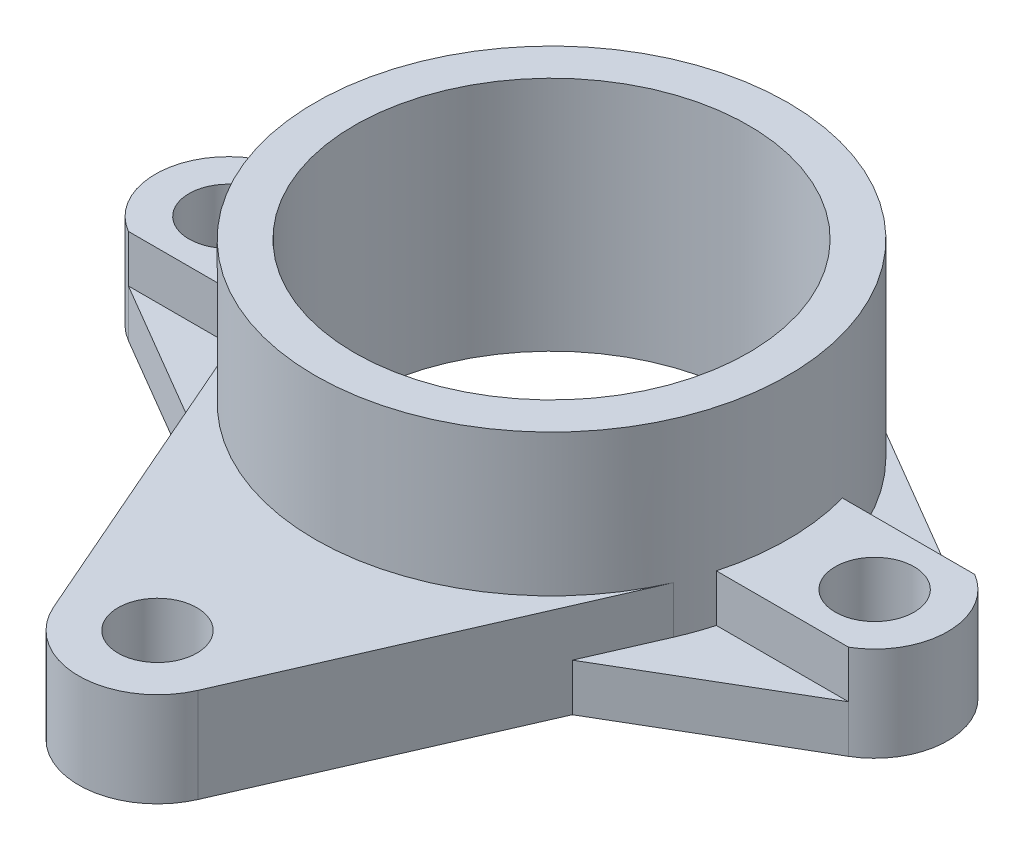
ISO-10303-21;
HEADER;
FILE_DESCRIPTION(('STEP AP214'),'2;1');
FILE_NAME('part.step','',(''),(''),'','','');
FILE_SCHEMA(('AUTOMOTIVE_DESIGN { 1 0 10303 214 1 1 1 1 }'));
ENDSEC;
DATA;
#1=APPLICATION_CONTEXT('core data for automotive mechanical design processes');
#2=APPLICATION_PROTOCOL_DEFINITION('international standard','automotive_design',2000,#1);
#3=PRODUCT_CONTEXT('',#1,'mechanical');
#4=PRODUCT('Part','Part','',(#3));
#5=PRODUCT_RELATED_PRODUCT_CATEGORY('part','',(#4));
#6=PRODUCT_DEFINITION_FORMATION('','',#4);
#7=PRODUCT_DEFINITION_CONTEXT('part definition',#1,'design');
#8=PRODUCT_DEFINITION('design','',#6,#7);
#9=PRODUCT_DEFINITION_SHAPE('','',#8);
#10=(LENGTH_UNIT() NAMED_UNIT(*) SI_UNIT(.MILLI.,.METRE.));
#11=(NAMED_UNIT(*) PLANE_ANGLE_UNIT() SI_UNIT($,.RADIAN.));
#12=(NAMED_UNIT(*) SI_UNIT($,.STERADIAN.) SOLID_ANGLE_UNIT());
#13=UNCERTAINTY_MEASURE_WITH_UNIT(LENGTH_MEASURE(1.E-05),#10,'distance_accuracy_value','');
#14=(GEOMETRIC_REPRESENTATION_CONTEXT(3) GLOBAL_UNCERTAINTY_ASSIGNED_CONTEXT((#13)) GLOBAL_UNIT_ASSIGNED_CONTEXT((#10,
#11,#12)) REPRESENTATION_CONTEXT('',''));
#15=CARTESIAN_POINT('',(0.,0.,0.));
#16=DIRECTION('',(0.,0.,1.));
#17=DIRECTION('',(1.,0.,0.));
#18=AXIS2_PLACEMENT_3D('',#15,#16,#17);
#19=CARTESIAN_POINT('',(-41.,12.,0.));
#20=DIRECTION('',(0.,1.,0.));
#21=DIRECTION('',(0.,0.,1.));
#22=AXIS2_PLACEMENT_3D('',#19,#20,#21);
#23=PLANE('',#22);
#24=CARTESIAN_POINT('',(41.,12.,0.));
#25=DIRECTION('',(0.,1.,0.));
#26=DIRECTION('',(0.,0.,1.));
#27=AXIS2_PLACEMENT_3D('',#24,#25,#26);
#28=CIRCLE('',#27,4.99999999999999);
#29=CARTESIAN_POINT('',(41.,12.,4.99999999999994));
#30=VERTEX_POINT('',#29);
#31=EDGE_CURVE('E407',#30,#30,#28,.T.);
#32=ORIENTED_EDGE('',*,*,#31,.F.);
#33=EDGE_LOOP('',(#32));
#34=FACE_BOUND('',#33,.T.);
#35=CARTESIAN_POINT('',(0.,12.,0.));
#36=DIRECTION('',(0.,1.,0.));
#37=DIRECTION('',(0.,0.,1.));
#38=AXIS2_PLACEMENT_3D('',#35,#36,#37);
#39=CIRCLE('',#38,30.);
#40=CARTESIAN_POINT('',(28.9136645896019,12.,7.99999999999999));
#41=VERTEX_POINT('',#40);
#42=CARTESIAN_POINT('',(28.9136645896019,12.,-8.00000000000001));
#43=VERTEX_POINT('',#42);
#44=EDGE_CURVE('E11',#41,#43,#39,.T.);
#45=ORIENTED_EDGE('',*,*,#44,.F.);
#46=DIRECTION('',(1.,0.,0.));
#47=VECTOR('',#46,1.);
#48=CARTESIAN_POINT('',(28.9136645896019,12.,7.99999999999999));
#49=LINE('',#48,#47);
#50=CARTESIAN_POINT('',(45.6876183465147,12.,7.99999999999994));
#51=VERTEX_POINT('',#50);
#52=EDGE_CURVE('E172',#41,#51,#49,.T.);
#53=ORIENTED_EDGE('',*,*,#52,.T.);
#54=CARTESIAN_POINT('',(41.,12.,0.));
#55=DIRECTION('',(0.,1.,0.));
#56=DIRECTION('',(0.,0.,1.));
#57=AXIS2_PLACEMENT_3D('',#54,#55,#56);
#58=CIRCLE('',#57,9.27220393232271);
#59=CARTESIAN_POINT('',(45.6876183465146,12.,-8.));
#60=VERTEX_POINT('',#59);
#61=EDGE_CURVE('E123',#51,#60,#58,.T.);
#62=ORIENTED_EDGE('',*,*,#61,.T.);
#63=DIRECTION('',(-1.,0.,0.));
#64=VECTOR('',#63,1.);
#65=CARTESIAN_POINT('',(45.6876183465146,12.,-8.));
#66=LINE('',#65,#64);
#67=EDGE_CURVE('E118',#60,#43,#66,.T.);
#68=ORIENTED_EDGE('',*,*,#67,.T.);
#69=EDGE_LOOP('',(#45,#53,#62,#68));
#70=FACE_BOUND('',#69,.T.);
#71=ADVANCED_FACE('F35',(#34,#70),#23,.T.);
#72=CARTESIAN_POINT('',(-41.,12.,0.));
#73=DIRECTION('',(0.,1.,0.));
#74=DIRECTION('',(0.,0.,1.));
#75=AXIS2_PLACEMENT_3D('',#72,#73,#74);
#76=CIRCLE('',#75,4.99999999999999);
#77=CARTESIAN_POINT('',(-41.,12.,4.99999999999999));
#78=VERTEX_POINT('',#77);
#79=EDGE_CURVE('E415',#78,#78,#76,.T.);
#80=ORIENTED_EDGE('',*,*,#79,.F.);
#81=EDGE_LOOP('',(#80));
#82=FACE_BOUND('',#81,.T.);
#83=CARTESIAN_POINT('',(-28.9136645896019,12.,-8.00000000000001));
#84=VERTEX_POINT('',#83);
#85=CARTESIAN_POINT('',(-28.9136645896019,12.,8.));
#86=VERTEX_POINT('',#85);
#87=EDGE_CURVE('E45',#84,#86,#39,.T.);
#88=ORIENTED_EDGE('',*,*,#87,.F.);
#89=DIRECTION('',(-1.,0.,0.));
#90=VECTOR('',#89,1.);
#91=CARTESIAN_POINT('',(-28.9136645896019,12.,-8.00000000000001));
#92=LINE('',#91,#90);
#93=CARTESIAN_POINT('',(-45.6876183465147,12.,-8.));
#94=VERTEX_POINT('',#93);
#95=EDGE_CURVE('E97',#84,#94,#92,.T.);
#96=ORIENTED_EDGE('',*,*,#95,.T.);
#97=CARTESIAN_POINT('',(-41.,12.,0.));
#98=DIRECTION('',(0.,1.,0.));
#99=DIRECTION('',(0.,0.,1.));
#100=AXIS2_PLACEMENT_3D('',#97,#98,#99);
#101=CIRCLE('',#100,9.27220393232274);
#102=CARTESIAN_POINT('',(-45.6876183465147,12.,8.));
#103=VERTEX_POINT('',#102);
#104=EDGE_CURVE('E159',#94,#103,#101,.T.);
#105=ORIENTED_EDGE('',*,*,#104,.T.);
#106=DIRECTION('',(1.,0.,0.));
#107=VECTOR('',#106,1.);
#108=CARTESIAN_POINT('',(-45.6876183465147,12.,8.));
#109=LINE('',#108,#107);
#110=EDGE_CURVE('E99',#103,#86,#109,.T.);
#111=ORIENTED_EDGE('',*,*,#110,.T.);
#112=EDGE_LOOP('',(#88,#96,#105,#111));
#113=FACE_BOUND('',#112,.T.);
#114=ADVANCED_FACE('F94',(#82,#113),#23,.T.);
#115=CARTESIAN_POINT('',(-41.,6.,0.));
#116=DIRECTION('',(0.,1.,0.));
#117=DIRECTION('',(0.,0.,1.));
#118=AXIS2_PLACEMENT_3D('',#115,#116,#117);
#119=CYLINDRICAL_SURFACE('',#118,9.27220393232274);
#120=ORIENTED_EDGE('',*,*,#104,.F.);
#121=DIRECTION('',(0.,1.,0.));
#122=VECTOR('',#121,1.);
#123=CARTESIAN_POINT('',(-45.6876183465147,6.,-8.));
#124=LINE('',#123,#122);
#125=CARTESIAN_POINT('',(-45.6876183465147,6.,-8.));
#126=VERTEX_POINT('',#125);
#127=EDGE_CURVE('E111',#126,#94,#124,.T.);
#128=ORIENTED_EDGE('',*,*,#127,.F.);
#129=DIRECTION('',(0.,1.,0.));
#130=VECTOR('',#129,1.);
#131=CARTESIAN_POINT('',(-45.6876183465147,0.,-8.));
#132=LINE('',#131,#130);
#133=CARTESIAN_POINT('',(-45.6876183465147,0.,-8.));
#134=VERTEX_POINT('',#133);
#135=EDGE_CURVE('E314',#134,#126,#132,.T.);
#136=ORIENTED_EDGE('',*,*,#135,.F.);
#137=CARTESIAN_POINT('',(-41.,0.,0.));
#138=DIRECTION('',(0.,-1.,0.));
#139=DIRECTION('',(0.,0.,1.));
#140=AXIS2_PLACEMENT_3D('',#137,#138,#139);
#141=CIRCLE('',#140,9.27220393232274);
#142=CARTESIAN_POINT('',(-45.6876183465147,0.,8.));
#143=VERTEX_POINT('',#142);
#144=EDGE_CURVE('E297',#143,#134,#141,.T.);
#145=ORIENTED_EDGE('',*,*,#144,.F.);
#146=DIRECTION('',(0.,1.,0.));
#147=VECTOR('',#146,1.);
#148=CARTESIAN_POINT('',(-45.6876183465147,0.,8.));
#149=LINE('',#148,#147);
#150=CARTESIAN_POINT('',(-45.6876183465147,6.,8.));
#151=VERTEX_POINT('',#150);
#152=EDGE_CURVE('E316',#143,#151,#149,.T.);
#153=ORIENTED_EDGE('',*,*,#152,.T.);
#154=DIRECTION('',(0.,1.,0.));
#155=VECTOR('',#154,1.);
#156=CARTESIAN_POINT('',(-45.6876183465147,6.,8.));
#157=LINE('',#156,#155);
#158=EDGE_CURVE('E39',#151,#103,#157,.T.);
#159=ORIENTED_EDGE('',*,*,#158,.T.);
#160=EDGE_LOOP('',(#120,#128,#136,#145,#153,#159));
#161=FACE_BOUND('',#160,.T.);
#162=ADVANCED_FACE('F37',(#161),#119,.T.);
#163=CARTESIAN_POINT('',(-28.9136645896019,6.,-8.00000000000001));
#164=DIRECTION('',(0.,0.,-1.));
#165=DIRECTION('',(-1.,0.,0.));
#166=AXIS2_PLACEMENT_3D('',#163,#164,#165);
#167=PLANE('',#166);
#168=ORIENTED_EDGE('',*,*,#95,.F.);
#169=DIRECTION('',(0.,1.,0.));
#170=VECTOR('',#169,1.);
#171=CARTESIAN_POINT('',(-28.9136645896019,6.,-8.00000000000001));
#172=LINE('',#171,#170);
#173=CARTESIAN_POINT('',(-28.9136645896019,6.,-8.00000000000001));
#174=VERTEX_POINT('',#173);
#175=EDGE_CURVE('E103',#174,#84,#172,.T.);
#176=ORIENTED_EDGE('',*,*,#175,.F.);
#177=DIRECTION('',(-1.,0.,0.));
#178=VECTOR('',#177,1.);
#179=CARTESIAN_POINT('',(-28.9136645896019,6.,-8.00000000000001));
#180=LINE('',#179,#178);
#181=EDGE_CURVE('E147',#174,#126,#180,.T.);
#182=ORIENTED_EDGE('',*,*,#181,.T.);
#183=ORIENTED_EDGE('',*,*,#127,.T.);
#184=EDGE_LOOP('',(#168,#176,#182,#183));
#185=FACE_BOUND('',#184,.T.);
#186=ADVANCED_FACE('F114',(#185),#167,.T.);
#187=CARTESIAN_POINT('',(0.,6.,0.));
#188=DIRECTION('',(0.,1.,0.));
#189=DIRECTION('',(0.,0.,1.));
#190=AXIS2_PLACEMENT_3D('',#187,#188,#189);
#191=CYLINDRICAL_SURFACE('',#190,30.);
#192=ORIENTED_EDGE('',*,*,#175,.T.);
#193=ORIENTED_EDGE('',*,*,#87,.T.);
#194=DIRECTION('',(0.,1.,0.));
#195=VECTOR('',#194,1.);
#196=CARTESIAN_POINT('',(-28.9136645896019,6.,8.));
#197=LINE('',#196,#195);
#198=CARTESIAN_POINT('',(-28.9136645896019,6.,8.));
#199=VERTEX_POINT('',#198);
#200=EDGE_CURVE('E145',#199,#86,#197,.T.);
#201=ORIENTED_EDGE('',*,*,#200,.F.);
#202=CARTESIAN_POINT('',(0.,6.,0.));
#203=DIRECTION('',(0.,1.,0.));
#204=DIRECTION('',(0.,0.,1.));
#205=AXIS2_PLACEMENT_3D('',#202,#203,#204);
#206=CIRCLE('',#205,30.);
#207=CARTESIAN_POINT('',(-27.4954541697351,6.,12.));
#208=VERTEX_POINT('',#207);
#209=EDGE_CURVE('E54',#199,#208,#206,.T.);
#210=ORIENTED_EDGE('',*,*,#209,.T.);
#211=DIRECTION('',(0.,1.,0.));
#212=VECTOR('',#211,1.);
#213=CARTESIAN_POINT('',(-27.4954541697351,6.,12.));
#214=LINE('',#213,#212);
#215=CARTESIAN_POINT('',(-27.4954541697351,12.,12.));
#216=VERTEX_POINT('',#215);
#217=EDGE_CURVE('E143',#208,#216,#214,.T.);
#218=ORIENTED_EDGE('',*,*,#217,.T.);
#219=CARTESIAN_POINT('',(27.495454169735,12.,12.));
#220=VERTEX_POINT('',#219);
#221=EDGE_CURVE('E47',#216,#220,#39,.T.);
#222=ORIENTED_EDGE('',*,*,#221,.T.);
#223=DIRECTION('',(0.,1.,0.));
#224=VECTOR('',#223,1.);
#225=CARTESIAN_POINT('',(27.495454169735,6.,12.));
#226=LINE('',#225,#224);
#227=CARTESIAN_POINT('',(27.495454169735,6.,12.));
#228=VERTEX_POINT('',#227);
#229=EDGE_CURVE('E136',#228,#220,#226,.T.);
#230=ORIENTED_EDGE('',*,*,#229,.F.);
#231=CARTESIAN_POINT('',(0.,6.,0.));
#232=DIRECTION('',(0.,1.,0.));
#233=DIRECTION('',(0.,0.,1.));
#234=AXIS2_PLACEMENT_3D('',#231,#232,#233);
#235=CIRCLE('',#234,30.);
#236=CARTESIAN_POINT('',(28.9136645896019,6.,7.99999999999999));
#237=VERTEX_POINT('',#236);
#238=EDGE_CURVE('E332',#228,#237,#235,.T.);
#239=ORIENTED_EDGE('',*,*,#238,.T.);
#240=DIRECTION('',(0.,1.,0.));
#241=VECTOR('',#240,1.);
#242=CARTESIAN_POINT('',(28.9136645896019,6.,7.99999999999999));
#243=LINE('',#242,#241);
#244=EDGE_CURVE('E133',#237,#41,#243,.T.);
#245=ORIENTED_EDGE('',*,*,#244,.T.);
#246=ORIENTED_EDGE('',*,*,#44,.T.);
#247=DIRECTION('',(0.,1.,0.));
#248=VECTOR('',#247,1.);
#249=CARTESIAN_POINT('',(28.9136645896019,6.,-8.00000000000001));
#250=LINE('',#249,#248);
#251=CARTESIAN_POINT('',(28.9136645896019,6.,-8.00000000000001));
#252=VERTEX_POINT('',#251);
#253=EDGE_CURVE('E112',#252,#43,#250,.T.);
#254=ORIENTED_EDGE('',*,*,#253,.F.);
#255=CARTESIAN_POINT('',(0.,6.,0.));
#256=DIRECTION('',(0.,1.,0.));
#257=DIRECTION('',(0.,0.,1.));
#258=AXIS2_PLACEMENT_3D('',#255,#256,#257);
#259=CIRCLE('',#258,30.);
#260=CARTESIAN_POINT('',(15.16668004952,6.,-25.8838137892293));
#261=VERTEX_POINT('',#260);
#262=EDGE_CURVE('E151',#252,#261,#259,.T.);
#263=ORIENTED_EDGE('',*,*,#262,.T.);
#264=DIRECTION('',(0.,1.,0.));
#265=VECTOR('',#264,1.);
#266=CARTESIAN_POINT('',(15.16668004952,0.,-25.8838137892293));
#267=LINE('',#266,#265);
#268=CARTESIAN_POINT('',(15.16668004952,0.,-25.8838137892293));
#269=VERTEX_POINT('',#268);
#270=EDGE_CURVE('E161',#269,#261,#267,.T.);
#271=ORIENTED_EDGE('',*,*,#270,.F.);
#272=CARTESIAN_POINT('',(0.,0.,0.));
#273=DIRECTION('',(0.,-1.,0.));
#274=DIRECTION('',(0.,0.,1.));
#275=AXIS2_PLACEMENT_3D('',#272,#273,#274);
#276=CIRCLE('',#275,30.);
#277=CARTESIAN_POINT('',(-15.16668004952,0.,-25.8838137892292));
#278=VERTEX_POINT('',#277);
#279=EDGE_CURVE('E277',#278,#269,#276,.T.);
#280=ORIENTED_EDGE('',*,*,#279,.F.);
#281=DIRECTION('',(0.,1.,0.));
#282=VECTOR('',#281,1.);
#283=CARTESIAN_POINT('',(-15.16668004952,0.,-25.8838137892292));
#284=LINE('',#283,#282);
#285=CARTESIAN_POINT('',(-15.16668004952,6.,-25.8838137892292));
#286=VERTEX_POINT('',#285);
#287=EDGE_CURVE('E301',#278,#286,#284,.T.);
#288=ORIENTED_EDGE('',*,*,#287,.T.);
#289=EDGE_CURVE('E108',#286,#174,#259,.T.);
#290=ORIENTED_EDGE('',*,*,#289,.T.);
#291=EDGE_LOOP('',(#192,#193,#201,#210,#218,#222,#230,#239,#245,#246,#254,#263,#271,#280,#288,#290));
#292=FACE_BOUND('',#291,.T.);
#293=CARTESIAN_POINT('',(0.,30.,0.));
#294=DIRECTION('',(0.,1.,0.));
#295=DIRECTION('',(0.,0.,1.));
#296=AXIS2_PLACEMENT_3D('',#293,#294,#295);
#297=CIRCLE('',#296,30.);
#298=CARTESIAN_POINT('',(0.,30.,30.));
#299=VERTEX_POINT('',#298);
#300=EDGE_CURVE('E275',#299,#299,#297,.T.);
#301=ORIENTED_EDGE('',*,*,#300,.F.);
#302=EDGE_LOOP('',(#301));
#303=FACE_BOUND('',#302,.T.);
#304=ADVANCED_FACE('F104',(#292,#303),#191,.T.);
#305=CARTESIAN_POINT('',(45.6876183465146,6.,-8.));
#306=DIRECTION('',(0.,0.,-1.));
#307=DIRECTION('',(-1.,0.,0.));
#308=AXIS2_PLACEMENT_3D('',#305,#306,#307);
#309=PLANE('',#308);
#310=ORIENTED_EDGE('',*,*,#67,.F.);
#311=DIRECTION('',(0.,1.,0.));
#312=VECTOR('',#311,1.);
#313=CARTESIAN_POINT('',(45.6876183465146,6.,-8.));
#314=LINE('',#313,#312);
#315=CARTESIAN_POINT('',(45.6876183465146,6.,-8.));
#316=VERTEX_POINT('',#315);
#317=EDGE_CURVE('E129',#316,#60,#314,.T.);
#318=ORIENTED_EDGE('',*,*,#317,.F.);
#319=DIRECTION('',(-1.,0.,0.));
#320=VECTOR('',#319,1.);
#321=CARTESIAN_POINT('',(45.6876183465146,6.,-8.));
#322=LINE('',#321,#320);
#323=EDGE_CURVE('E197',#316,#252,#322,.T.);
#324=ORIENTED_EDGE('',*,*,#323,.T.);
#325=ORIENTED_EDGE('',*,*,#253,.T.);
#326=EDGE_LOOP('',(#310,#318,#324,#325));
#327=FACE_BOUND('',#326,.T.);
#328=ADVANCED_FACE('F193',(#327),#309,.T.);
#329=CARTESIAN_POINT('',(41.,6.,0.));
#330=DIRECTION('',(0.,1.,0.));
#331=DIRECTION('',(0.,0.,1.));
#332=AXIS2_PLACEMENT_3D('',#329,#330,#331);
#333=CYLINDRICAL_SURFACE('',#332,9.27220393232271);
#334=ORIENTED_EDGE('',*,*,#61,.F.);
#335=DIRECTION('',(0.,1.,0.));
#336=VECTOR('',#335,1.);
#337=CARTESIAN_POINT('',(45.6876183465147,6.,7.99999999999994));
#338=LINE('',#337,#336);
#339=CARTESIAN_POINT('',(45.6876183465147,6.,7.99999999999994));
#340=VERTEX_POINT('',#339);
#341=EDGE_CURVE('E131',#340,#51,#338,.T.);
#342=ORIENTED_EDGE('',*,*,#341,.F.);
#343=DIRECTION('',(0.,1.,0.));
#344=VECTOR('',#343,1.);
#345=CARTESIAN_POINT('',(45.6876183465147,0.,7.99999999999994));
#346=LINE('',#345,#344);
#347=CARTESIAN_POINT('',(45.6876183465147,0.,7.99999999999994));
#348=VERTEX_POINT('',#347);
#349=EDGE_CURVE('E322',#348,#340,#346,.T.);
#350=ORIENTED_EDGE('',*,*,#349,.F.);
#351=CARTESIAN_POINT('',(41.,0.,0.));
#352=DIRECTION('',(0.,-1.,0.));
#353=DIRECTION('',(0.,0.,1.));
#354=AXIS2_PLACEMENT_3D('',#351,#352,#353);
#355=CIRCLE('',#354,9.27220393232271);
#356=CARTESIAN_POINT('',(45.6876183465146,0.,-8.));
#357=VERTEX_POINT('',#356);
#358=EDGE_CURVE('E283',#357,#348,#355,.T.);
#359=ORIENTED_EDGE('',*,*,#358,.F.);
#360=DIRECTION('',(0.,1.,0.));
#361=VECTOR('',#360,1.);
#362=CARTESIAN_POINT('',(45.6876183465146,0.,-8.));
#363=LINE('',#362,#361);
#364=EDGE_CURVE('E190',#357,#316,#363,.T.);
#365=ORIENTED_EDGE('',*,*,#364,.T.);
#366=ORIENTED_EDGE('',*,*,#317,.T.);
#367=EDGE_LOOP('',(#334,#342,#350,#359,#365,#366));
#368=FACE_BOUND('',#367,.T.);
#369=ADVANCED_FACE('F181',(#368),#333,.T.);
#370=CARTESIAN_POINT('',(28.9136645896019,6.,7.99999999999999));
#371=DIRECTION('',(0.,0.,1.));
#372=DIRECTION('',(1.,0.,0.));
#373=AXIS2_PLACEMENT_3D('',#370,#371,#372);
#374=PLANE('',#373);
#375=ORIENTED_EDGE('',*,*,#52,.F.);
#376=ORIENTED_EDGE('',*,*,#244,.F.);
#377=DIRECTION('',(1.,0.,0.));
#378=VECTOR('',#377,1.);
#379=CARTESIAN_POINT('',(28.9136645896019,6.,7.99999999999999));
#380=LINE('',#379,#378);
#381=EDGE_CURVE('E334',#237,#340,#380,.T.);
#382=ORIENTED_EDGE('',*,*,#381,.T.);
#383=ORIENTED_EDGE('',*,*,#341,.T.);
#384=EDGE_LOOP('',(#375,#376,#382,#383));
#385=FACE_BOUND('',#384,.T.);
#386=ADVANCED_FACE('F337',(#385),#374,.T.);
#387=CARTESIAN_POINT('',(9.1651513899117,6.,54.));
#388=DIRECTION('',(0.916515138991168,0.,0.4));
#389=DIRECTION('',(0.4,0.,-0.916515138991168));
#390=AXIS2_PLACEMENT_3D('',#387,#388,#389);
#391=PLANE('',#390);
#392=DIRECTION('',(0.4,0.,-0.916515138991168));
#393=VECTOR('',#392,1.);
#394=CARTESIAN_POINT('',(9.1651513899117,12.,54.));
#395=LINE('',#394,#393);
#396=CARTESIAN_POINT('',(9.1651513899117,12.,54.));
#397=VERTEX_POINT('',#396);
#398=EDGE_CURVE('E169',#397,#220,#395,.T.);
#399=ORIENTED_EDGE('',*,*,#398,.F.);
#400=DIRECTION('',(0.,1.,0.));
#401=VECTOR('',#400,1.);
#402=CARTESIAN_POINT('',(9.1651513899117,6.,54.));
#403=LINE('',#402,#401);
#404=CARTESIAN_POINT('',(9.1651513899117,0.,54.));
#405=VERTEX_POINT('',#404);
#406=EDGE_CURVE('E139',#405,#397,#403,.T.);
#407=ORIENTED_EDGE('',*,*,#406,.F.);
#408=DIRECTION('',(-0.4,0.,0.916515138991168));
#409=VECTOR('',#408,1.);
#410=CARTESIAN_POINT('',(9.1651513899117,0.,54.));
#411=LINE('',#410,#409);
#412=CARTESIAN_POINT('',(23.5902166911198,0.,20.9480231762664));
#413=VERTEX_POINT('',#412);
#414=EDGE_CURVE('E287',#413,#405,#411,.T.);
#415=ORIENTED_EDGE('',*,*,#414,.F.);
#416=DIRECTION('',(0.,1.,0.));
#417=VECTOR('',#416,1.);
#418=CARTESIAN_POINT('',(23.5902166911198,0.,20.9480231762664));
#419=LINE('',#418,#417);
#420=CARTESIAN_POINT('',(23.5902166911198,6.,20.9480231762664));
#421=VERTEX_POINT('',#420);
#422=EDGE_CURVE('E320',#413,#421,#419,.T.);
#423=ORIENTED_EDGE('',*,*,#422,.T.);
#424=DIRECTION('',(0.4,0.,-0.916515138991168));
#425=VECTOR('',#424,1.);
#426=CARTESIAN_POINT('',(9.1651513899117,6.,54.));
#427=LINE('',#426,#425);
#428=EDGE_CURVE('E269',#421,#228,#427,.T.);
#429=ORIENTED_EDGE('',*,*,#428,.T.);
#430=ORIENTED_EDGE('',*,*,#229,.T.);
#431=EDGE_LOOP('',(#399,#407,#415,#423,#429,#430));
#432=FACE_BOUND('',#431,.T.);
#433=ADVANCED_FACE('F267',(#432),#391,.T.);
#434=CARTESIAN_POINT('',(0.,6.,50.));
#435=DIRECTION('',(0.,1.,0.));
#436=DIRECTION('',(0.,0.,1.));
#437=AXIS2_PLACEMENT_3D('',#434,#435,#436);
#438=CYLINDRICAL_SURFACE('',#437,10.);
#439=CARTESIAN_POINT('',(0.,12.,50.));
#440=DIRECTION('',(0.,1.,0.));
#441=DIRECTION('',(0.,0.,1.));
#442=AXIS2_PLACEMENT_3D('',#439,#440,#441);
#443=CIRCLE('',#442,10.);
#444=CARTESIAN_POINT('',(-9.16515138991167,12.,54.));
#445=VERTEX_POINT('',#444);
#446=EDGE_CURVE('E166',#445,#397,#443,.T.);
#447=ORIENTED_EDGE('',*,*,#446,.F.);
#448=DIRECTION('',(0.,1.,0.));
#449=VECTOR('',#448,1.);
#450=CARTESIAN_POINT('',(-9.16515138991167,6.,54.));
#451=LINE('',#450,#449);
#452=CARTESIAN_POINT('',(-9.16515138991167,0.,54.));
#453=VERTEX_POINT('',#452);
#454=EDGE_CURVE('E141',#453,#445,#451,.T.);
#455=ORIENTED_EDGE('',*,*,#454,.F.);
#456=CARTESIAN_POINT('',(0.,0.,50.));
#457=DIRECTION('',(0.,-1.,0.));
#458=DIRECTION('',(0.,0.,1.));
#459=AXIS2_PLACEMENT_3D('',#456,#457,#458);
#460=CIRCLE('',#459,10.);
#461=EDGE_CURVE('E290',#405,#453,#460,.T.);
#462=ORIENTED_EDGE('',*,*,#461,.F.);
#463=ORIENTED_EDGE('',*,*,#406,.T.);
#464=EDGE_LOOP('',(#447,#455,#462,#463));
#465=FACE_BOUND('',#464,.T.);
#466=ADVANCED_FACE('F351',(#465),#438,.T.);
#467=CARTESIAN_POINT('',(-27.4954541697351,6.,12.));
#468=DIRECTION('',(-0.916515138991168,0.,0.4));
#469=DIRECTION('',(0.4,0.,0.916515138991168));
#470=AXIS2_PLACEMENT_3D('',#467,#468,#469);
#471=PLANE('',#470);
#472=DIRECTION('',(0.4,0.,0.916515138991168));
#473=VECTOR('',#472,1.);
#474=CARTESIAN_POINT('',(-27.4954541697351,12.,12.));
#475=LINE('',#474,#473);
#476=EDGE_CURVE('E163',#216,#445,#475,.T.);
#477=ORIENTED_EDGE('',*,*,#476,.F.);
#478=ORIENTED_EDGE('',*,*,#217,.F.);
#479=DIRECTION('',(0.4,0.,0.916515138991168));
#480=VECTOR('',#479,1.);
#481=CARTESIAN_POINT('',(-27.4954541697351,6.,12.));
#482=LINE('',#481,#480);
#483=CARTESIAN_POINT('',(-23.5902166911198,6.,20.9480231762665));
#484=VERTEX_POINT('',#483);
#485=EDGE_CURVE('E328',#208,#484,#482,.T.);
#486=ORIENTED_EDGE('',*,*,#485,.T.);
#487=DIRECTION('',(0.,1.,0.));
#488=VECTOR('',#487,1.);
#489=CARTESIAN_POINT('',(-23.5902166911198,0.,20.9480231762665));
#490=LINE('',#489,#488);
#491=CARTESIAN_POINT('',(-23.5902166911198,0.,20.9480231762665));
#492=VERTEX_POINT('',#491);
#493=EDGE_CURVE('E318',#492,#484,#490,.T.);
#494=ORIENTED_EDGE('',*,*,#493,.F.);
#495=DIRECTION('',(-0.4,0.,-0.916515138991168));
#496=VECTOR('',#495,1.);
#497=CARTESIAN_POINT('',(-23.5902166911198,0.,20.9480231762665));
#498=LINE('',#497,#496);
#499=EDGE_CURVE('E293',#453,#492,#498,.T.);
#500=ORIENTED_EDGE('',*,*,#499,.F.);
#501=ORIENTED_EDGE('',*,*,#454,.T.);
#502=EDGE_LOOP('',(#477,#478,#486,#494,#500,#501));
#503=FACE_BOUND('',#502,.T.);
#504=ADVANCED_FACE('F353',(#503),#471,.T.);
#505=CARTESIAN_POINT('',(-45.6876183465147,6.,8.));
#506=DIRECTION('',(0.,0.,1.));
#507=DIRECTION('',(1.,0.,0.));
#508=AXIS2_PLACEMENT_3D('',#505,#506,#507);
#509=PLANE('',#508);
#510=ORIENTED_EDGE('',*,*,#110,.F.);
#511=ORIENTED_EDGE('',*,*,#158,.F.);
#512=DIRECTION('',(1.,0.,0.));
#513=VECTOR('',#512,1.);
#514=CARTESIAN_POINT('',(-45.6876183465147,6.,8.));
#515=LINE('',#514,#513);
#516=EDGE_CURVE('E117',#151,#199,#515,.T.);
#517=ORIENTED_EDGE('',*,*,#516,.T.);
#518=ORIENTED_EDGE('',*,*,#200,.T.);
#519=EDGE_LOOP('',(#510,#511,#517,#518));
#520=FACE_BOUND('',#519,.T.);
#521=ADVANCED_FACE('F393',(#520),#509,.T.);
#522=CARTESIAN_POINT('',(0.,12.,50.));
#523=DIRECTION('',(0.,1.,0.));
#524=DIRECTION('',(0.,0.,1.));
#525=AXIS2_PLACEMENT_3D('',#522,#523,#524);
#526=CIRCLE('',#525,4.99999999999999);
#527=CARTESIAN_POINT('',(0.,12.,55.));
#528=VERTEX_POINT('',#527);
#529=EDGE_CURVE('E400',#528,#528,#526,.T.);
#530=ORIENTED_EDGE('',*,*,#529,.F.);
#531=EDGE_LOOP('',(#530));
#532=FACE_BOUND('',#531,.T.);
#533=ORIENTED_EDGE('',*,*,#221,.F.);
#534=ORIENTED_EDGE('',*,*,#476,.T.);
#535=ORIENTED_EDGE('',*,*,#446,.T.);
#536=ORIENTED_EDGE('',*,*,#398,.T.);
#537=EDGE_LOOP('',(#533,#534,#535,#536));
#538=FACE_BOUND('',#537,.T.);
#539=ADVANCED_FACE('F261',(#532,#538),#23,.T.);
#540=CARTESIAN_POINT('',(0.,6.,0.));
#541=DIRECTION('',(0.,1.,0.));
#542=DIRECTION('',(0.,0.,1.));
#543=AXIS2_PLACEMENT_3D('',#540,#541,#542);
#544=PLANE('',#543);
#545=ORIENTED_EDGE('',*,*,#181,.F.);
#546=ORIENTED_EDGE('',*,*,#289,.F.);
#547=DIRECTION('',(0.862793792974308,0.,-0.505556001650664));
#548=VECTOR('',#547,1.);
#549=CARTESIAN_POINT('',(-15.16668004952,6.,-25.8838137892292));
#550=LINE('',#549,#548);
#551=EDGE_CURVE('E281',#126,#286,#550,.T.);
#552=ORIENTED_EDGE('',*,*,#551,.F.);
#553=EDGE_LOOP('',(#545,#546,#552));
#554=FACE_BOUND('',#553,.T.);
#555=ADVANCED_FACE('F372',(#554),#544,.T.);
#556=ORIENTED_EDGE('',*,*,#262,.F.);
#557=ORIENTED_EDGE('',*,*,#323,.F.);
#558=DIRECTION('',(0.862793792974307,0.,0.505556001650666));
#559=VECTOR('',#558,1.);
#560=CARTESIAN_POINT('',(45.6876183465146,6.,-8.));
#561=LINE('',#560,#559);
#562=EDGE_CURVE('E302',#261,#316,#561,.T.);
#563=ORIENTED_EDGE('',*,*,#562,.F.);
#564=EDGE_LOOP('',(#556,#557,#563));
#565=FACE_BOUND('',#564,.T.);
#566=ADVANCED_FACE('F370',(#565),#544,.T.);
#567=ORIENTED_EDGE('',*,*,#381,.F.);
#568=ORIENTED_EDGE('',*,*,#238,.F.);
#569=ORIENTED_EDGE('',*,*,#428,.F.);
#570=DIRECTION('',(-0.862793792974309,0.,0.505556001650663));
#571=VECTOR('',#570,1.);
#572=CARTESIAN_POINT('',(23.5902166911198,6.,20.9480231762664));
#573=LINE('',#572,#571);
#574=EDGE_CURVE('E305',#340,#421,#573,.T.);
#575=ORIENTED_EDGE('',*,*,#574,.F.);
#576=EDGE_LOOP('',(#567,#568,#569,#575));
#577=FACE_BOUND('',#576,.T.);
#578=ADVANCED_FACE('F340',(#577),#544,.T.);
#579=ORIENTED_EDGE('',*,*,#485,.F.);
#580=ORIENTED_EDGE('',*,*,#209,.F.);
#581=ORIENTED_EDGE('',*,*,#516,.F.);
#582=DIRECTION('',(-0.862793792974309,0.,-0.505556001650664));
#583=VECTOR('',#582,1.);
#584=CARTESIAN_POINT('',(-45.6876183465147,6.,8.));
#585=LINE('',#584,#583);
#586=EDGE_CURVE('E308',#484,#151,#585,.T.);
#587=ORIENTED_EDGE('',*,*,#586,.F.);
#588=EDGE_LOOP('',(#579,#580,#581,#587));
#589=FACE_BOUND('',#588,.T.);
#590=ADVANCED_FACE('F378',(#589),#544,.T.);
#591=CARTESIAN_POINT('',(45.6876183465146,0.,-8.));
#592=DIRECTION('',(-0.505556001650667,0.,0.862793792974307));
#593=DIRECTION('',(0.862793792974307,0.,0.505556001650667));
#594=AXIS2_PLACEMENT_3D('',#591,#592,#593);
#595=PLANE('',#594);
#596=ORIENTED_EDGE('',*,*,#562,.T.);
#597=ORIENTED_EDGE('',*,*,#364,.F.);
#598=DIRECTION('',(0.862793792974307,0.,0.505556001650666));
#599=VECTOR('',#598,1.);
#600=CARTESIAN_POINT('',(45.6876183465146,0.,-8.));
#601=LINE('',#600,#599);
#602=EDGE_CURVE('E280',#269,#357,#601,.T.);
#603=ORIENTED_EDGE('',*,*,#602,.F.);
#604=ORIENTED_EDGE('',*,*,#270,.T.);
#605=EDGE_LOOP('',(#596,#597,#603,#604));
#606=FACE_BOUND('',#605,.T.);
#607=ADVANCED_FACE('F369',(#606),#595,.F.);
#608=CARTESIAN_POINT('',(23.5902166911198,0.,20.9480231762664));
#609=DIRECTION('',(-0.505556001650663,0.,-0.862793792974309));
#610=DIRECTION('',(-0.862793792974309,0.,0.505556001650663));
#611=AXIS2_PLACEMENT_3D('',#608,#609,#610);
#612=PLANE('',#611);
#613=ORIENTED_EDGE('',*,*,#574,.T.);
#614=ORIENTED_EDGE('',*,*,#422,.F.);
#615=DIRECTION('',(-0.862793792974309,0.,0.505556001650663));
#616=VECTOR('',#615,1.);
#617=CARTESIAN_POINT('',(23.5902166911198,0.,20.9480231762664));
#618=LINE('',#617,#616);
#619=EDGE_CURVE('E285',#348,#413,#618,.T.);
#620=ORIENTED_EDGE('',*,*,#619,.F.);
#621=ORIENTED_EDGE('',*,*,#349,.T.);
#622=EDGE_LOOP('',(#613,#614,#620,#621));
#623=FACE_BOUND('',#622,.T.);
#624=ADVANCED_FACE('F343',(#623),#612,.F.);
#625=CARTESIAN_POINT('',(-45.6876183465147,0.,8.));
#626=DIRECTION('',(0.505556001650664,0.,-0.862793792974309));
#627=DIRECTION('',(-0.862793792974309,0.,-0.505556001650664));
#628=AXIS2_PLACEMENT_3D('',#625,#626,#627);
#629=PLANE('',#628);
#630=ORIENTED_EDGE('',*,*,#586,.T.);
#631=ORIENTED_EDGE('',*,*,#152,.F.);
#632=DIRECTION('',(-0.862793792974309,0.,-0.505556001650664));
#633=VECTOR('',#632,1.);
#634=CARTESIAN_POINT('',(-45.6876183465147,0.,8.));
#635=LINE('',#634,#633);
#636=EDGE_CURVE('E295',#492,#143,#635,.T.);
#637=ORIENTED_EDGE('',*,*,#636,.F.);
#638=ORIENTED_EDGE('',*,*,#493,.T.);
#639=EDGE_LOOP('',(#630,#631,#637,#638));
#640=FACE_BOUND('',#639,.T.);
#641=ADVANCED_FACE('F360',(#640),#629,.F.);
#642=CARTESIAN_POINT('',(-15.16668004952,0.,-25.8838137892292));
#643=DIRECTION('',(0.505556001650664,0.,0.862793792974308));
#644=DIRECTION('',(0.862793792974308,0.,-0.505556001650664));
#645=AXIS2_PLACEMENT_3D('',#642,#643,#644);
#646=PLANE('',#645);
#647=ORIENTED_EDGE('',*,*,#551,.T.);
#648=ORIENTED_EDGE('',*,*,#287,.F.);
#649=DIRECTION('',(0.862793792974308,0.,-0.505556001650664));
#650=VECTOR('',#649,1.);
#651=CARTESIAN_POINT('',(-15.16668004952,0.,-25.8838137892292));
#652=LINE('',#651,#650);
#653=EDGE_CURVE('E299',#134,#278,#652,.T.);
#654=ORIENTED_EDGE('',*,*,#653,.F.);
#655=ORIENTED_EDGE('',*,*,#135,.T.);
#656=EDGE_LOOP('',(#647,#648,#654,#655));
#657=FACE_BOUND('',#656,.T.);
#658=ADVANCED_FACE('F366',(#657),#646,.F.);
#659=CARTESIAN_POINT('',(0.,0.,0.));
#660=DIRECTION('',(0.,1.,0.));
#661=DIRECTION('',(0.,0.,1.));
#662=AXIS2_PLACEMENT_3D('',#659,#660,#661);
#663=PLANE('',#662);
#664=CARTESIAN_POINT('',(0.,0.,0.));
#665=DIRECTION('',(0.,1.,0.));
#666=DIRECTION('',(0.,0.,1.));
#667=AXIS2_PLACEMENT_3D('',#664,#665,#666);
#668=CIRCLE('',#667,25.);
#669=CARTESIAN_POINT('',(0.,0.,25.));
#670=VERTEX_POINT('',#669);
#671=EDGE_CURVE('E418',#670,#670,#668,.T.);
#672=ORIENTED_EDGE('',*,*,#671,.T.);
#673=EDGE_LOOP('',(#672));
#674=FACE_BOUND('',#673,.T.);
#675=CARTESIAN_POINT('',(-41.,0.,0.));
#676=DIRECTION('',(0.,1.,0.));
#677=DIRECTION('',(0.,0.,1.));
#678=AXIS2_PLACEMENT_3D('',#675,#676,#677);
#679=CIRCLE('',#678,4.99999999999998);
#680=CARTESIAN_POINT('',(-41.,0.,4.99999999999998));
#681=VERTEX_POINT('',#680);
#682=EDGE_CURVE('E412',#681,#681,#679,.T.);
#683=ORIENTED_EDGE('',*,*,#682,.T.);
#684=EDGE_LOOP('',(#683));
#685=FACE_BOUND('',#684,.T.);
#686=CARTESIAN_POINT('',(41.,0.,0.));
#687=DIRECTION('',(0.,1.,0.));
#688=DIRECTION('',(0.,0.,1.));
#689=AXIS2_PLACEMENT_3D('',#686,#687,#688);
#690=CIRCLE('',#689,4.99999999999998);
#691=CARTESIAN_POINT('',(41.,0.,4.99999999999993));
#692=VERTEX_POINT('',#691);
#693=EDGE_CURVE('E403',#692,#692,#690,.T.);
#694=ORIENTED_EDGE('',*,*,#693,.T.);
#695=EDGE_LOOP('',(#694));
#696=FACE_BOUND('',#695,.T.);
#697=CARTESIAN_POINT('',(0.,0.,50.));
#698=DIRECTION('',(0.,1.,0.));
#699=DIRECTION('',(0.,0.,1.));
#700=AXIS2_PLACEMENT_3D('',#697,#698,#699);
#701=CIRCLE('',#700,4.99999999999999);
#702=CARTESIAN_POINT('',(0.,0.,55.));
#703=VERTEX_POINT('',#702);
#704=EDGE_CURVE('E402',#703,#703,#701,.T.);
#705=ORIENTED_EDGE('',*,*,#704,.T.);
#706=EDGE_LOOP('',(#705));
#707=FACE_BOUND('',#706,.T.);
#708=ORIENTED_EDGE('',*,*,#279,.T.);
#709=ORIENTED_EDGE('',*,*,#602,.T.);
#710=ORIENTED_EDGE('',*,*,#358,.T.);
#711=ORIENTED_EDGE('',*,*,#619,.T.);
#712=ORIENTED_EDGE('',*,*,#414,.T.);
#713=ORIENTED_EDGE('',*,*,#461,.T.);
#714=ORIENTED_EDGE('',*,*,#499,.T.);
#715=ORIENTED_EDGE('',*,*,#636,.T.);
#716=ORIENTED_EDGE('',*,*,#144,.T.);
#717=ORIENTED_EDGE('',*,*,#653,.T.);
#718=EDGE_LOOP('',(#708,#709,#710,#711,#712,#713,#714,#715,#716,#717));
#719=FACE_BOUND('',#718,.T.);
#720=ADVANCED_FACE('F348',(#674,#685,#696,#707,#719),#663,.F.);
#721=CARTESIAN_POINT('',(0.,30.,0.));
#722=DIRECTION('',(0.,1.,0.));
#723=DIRECTION('',(0.,0.,1.));
#724=AXIS2_PLACEMENT_3D('',#721,#722,#723);
#725=PLANE('',#724);
#726=CARTESIAN_POINT('',(0.,30.,0.));
#727=DIRECTION('',(0.,1.,0.));
#728=DIRECTION('',(0.,0.,1.));
#729=AXIS2_PLACEMENT_3D('',#726,#727,#728);
#730=CIRCLE('',#729,25.);
#731=CARTESIAN_POINT('',(0.,30.,25.));
#732=VERTEX_POINT('',#731);
#733=EDGE_CURVE('E421',#732,#732,#730,.T.);
#734=ORIENTED_EDGE('',*,*,#733,.F.);
#735=EDGE_LOOP('',(#734));
#736=FACE_BOUND('',#735,.T.);
#737=ORIENTED_EDGE('',*,*,#300,.T.);
#738=EDGE_LOOP('',(#737));
#739=FACE_BOUND('',#738,.T.);
#740=ADVANCED_FACE('F427',(#736,#739),#725,.T.);
#741=CARTESIAN_POINT('',(0.,12.,50.));
#742=DIRECTION('',(0.,1.,0.));
#743=DIRECTION('',(0.,0.,1.));
#744=AXIS2_PLACEMENT_3D('',#741,#742,#743);
#745=CYLINDRICAL_SURFACE('',#744,4.99999999999999);
#746=ORIENTED_EDGE('',*,*,#704,.F.);
#747=EDGE_LOOP('',(#746));
#748=FACE_BOUND('',#747,.T.);
#749=ORIENTED_EDGE('',*,*,#529,.T.);
#750=EDGE_LOOP('',(#749));
#751=FACE_BOUND('',#750,.T.);
#752=ADVANCED_FACE('F430',(#748,#751),#745,.F.);
#753=CARTESIAN_POINT('',(41.,12.,0.));
#754=DIRECTION('',(0.,1.,0.));
#755=DIRECTION('',(0.,0.,1.));
#756=AXIS2_PLACEMENT_3D('',#753,#754,#755);
#757=CYLINDRICAL_SURFACE('',#756,4.99999999999999);
#758=ORIENTED_EDGE('',*,*,#693,.F.);
#759=EDGE_LOOP('',(#758));
#760=FACE_BOUND('',#759,.T.);
#761=ORIENTED_EDGE('',*,*,#31,.T.);
#762=EDGE_LOOP('',(#761));
#763=FACE_BOUND('',#762,.T.);
#764=ADVANCED_FACE('F488',(#760,#763),#757,.F.);
#765=CARTESIAN_POINT('',(-41.,12.,0.));
#766=DIRECTION('',(0.,1.,0.));
#767=DIRECTION('',(0.,0.,1.));
#768=AXIS2_PLACEMENT_3D('',#765,#766,#767);
#769=CYLINDRICAL_SURFACE('',#768,4.99999999999999);
#770=ORIENTED_EDGE('',*,*,#682,.F.);
#771=EDGE_LOOP('',(#770));
#772=FACE_BOUND('',#771,.T.);
#773=ORIENTED_EDGE('',*,*,#79,.T.);
#774=EDGE_LOOP('',(#773));
#775=FACE_BOUND('',#774,.T.);
#776=ADVANCED_FACE('F499',(#772,#775),#769,.F.);
#777=CARTESIAN_POINT('',(0.,30.,0.));
#778=DIRECTION('',(0.,1.,0.));
#779=DIRECTION('',(0.,0.,1.));
#780=AXIS2_PLACEMENT_3D('',#777,#778,#779);
#781=CYLINDRICAL_SURFACE('',#780,25.);
#782=ORIENTED_EDGE('',*,*,#671,.F.);
#783=EDGE_LOOP('',(#782));
#784=FACE_BOUND('',#783,.T.);
#785=ORIENTED_EDGE('',*,*,#733,.T.);
#786=EDGE_LOOP('',(#785));
#787=FACE_BOUND('',#786,.T.);
#788=ADVANCED_FACE('F425',(#784,#787),#781,.F.);
#789=CLOSED_SHELL('',(#71,#114,#162,#186,#304,#328,#369,#386,#433,#466,#504,#521,#539,#555,#566,
#578,#590,#607,#624,#641,#658,#720,#740,#752,#764,#776,#788));
#790=MANIFOLD_SOLID_BREP('B2',#789);
#791=ADVANCED_BREP_SHAPE_REPRESENTATION('',(#18,#790),#14);
#792=SHAPE_DEFINITION_REPRESENTATION(#9,#791);
ENDSEC;
END-ISO-10303-21;
